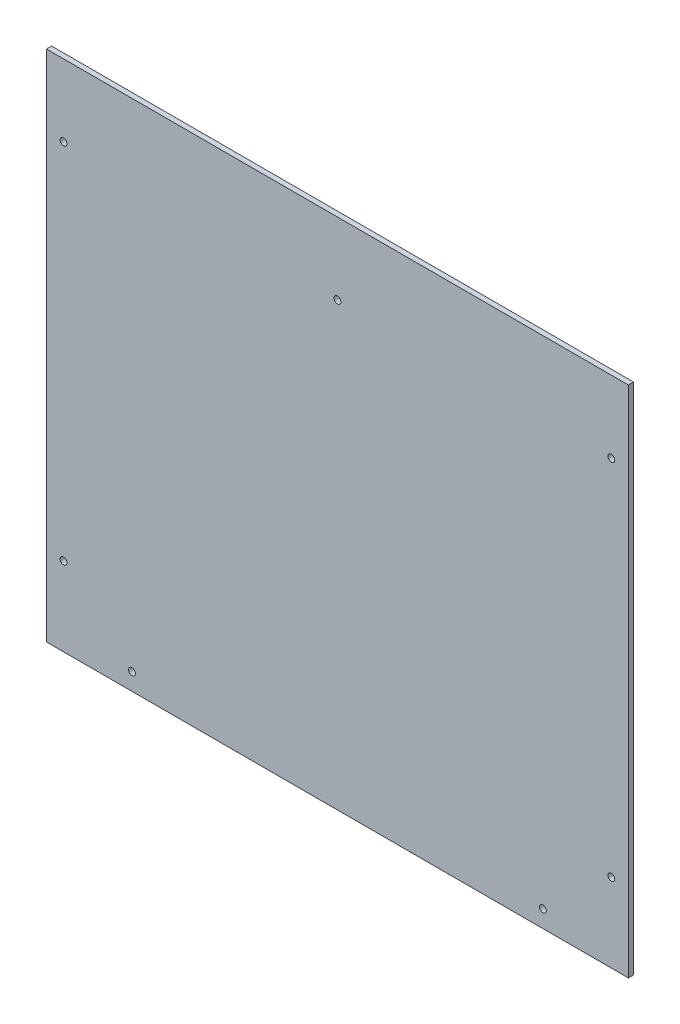
ISO-10303-21;
HEADER;
FILE_DESCRIPTION(('STEP AP214'),'2;1');
FILE_NAME('part.step','',(''),(''),'','','');
FILE_SCHEMA(('AUTOMOTIVE_DESIGN { 1 0 10303 214 1 1 1 1 }'));
ENDSEC;
DATA;
#1=APPLICATION_CONTEXT('core data for automotive mechanical design processes');
#2=APPLICATION_PROTOCOL_DEFINITION('international standard','automotive_design',2000,#1);
#3=PRODUCT_CONTEXT('',#1,'mechanical');
#4=PRODUCT('Part','Part','',(#3));
#5=PRODUCT_RELATED_PRODUCT_CATEGORY('part','',(#4));
#6=PRODUCT_DEFINITION_FORMATION('','',#4);
#7=PRODUCT_DEFINITION_CONTEXT('part definition',#1,'design');
#8=PRODUCT_DEFINITION('design','',#6,#7);
#9=PRODUCT_DEFINITION_SHAPE('','',#8);
#10=(LENGTH_UNIT() NAMED_UNIT(*) SI_UNIT(.MILLI.,.METRE.));
#11=(NAMED_UNIT(*) PLANE_ANGLE_UNIT() SI_UNIT($,.RADIAN.));
#12=(NAMED_UNIT(*) SI_UNIT($,.STERADIAN.) SOLID_ANGLE_UNIT());
#13=UNCERTAINTY_MEASURE_WITH_UNIT(LENGTH_MEASURE(1.E-05),#10,'distance_accuracy_value','');
#14=(GEOMETRIC_REPRESENTATION_CONTEXT(3) GLOBAL_UNCERTAINTY_ASSIGNED_CONTEXT((#13)) GLOBAL_UNIT_ASSIGNED_CONTEXT((#10,
#11,#12)) REPRESENTATION_CONTEXT('',''));
#15=CARTESIAN_POINT('',(0.,0.,0.));
#16=DIRECTION('',(0.,0.,1.));
#17=DIRECTION('',(1.,0.,0.));
#18=AXIS2_PLACEMENT_3D('',#15,#16,#17);
#19=CARTESIAN_POINT('',(-170.,0.,3.));
#20=DIRECTION('',(1.,0.,0.));
#21=DIRECTION('',(0.,1.,0.));
#22=AXIS2_PLACEMENT_3D('',#19,#20,#21);
#23=PLANE('',#22);
#24=DIRECTION('',(0.,0.,1.));
#25=VECTOR('',#24,1.);
#26=CARTESIAN_POINT('',(-170.,148.,0.));
#27=LINE('',#26,#25);
#28=CARTESIAN_POINT('',(-170.,148.,0.));
#29=VERTEX_POINT('',#28);
#30=CARTESIAN_POINT('',(-170.,148.,3.));
#31=VERTEX_POINT('',#30);
#32=EDGE_CURVE('E187',#29,#31,#27,.T.);
#33=ORIENTED_EDGE('',*,*,#32,.F.);
#34=DIRECTION('',(0.,-1.,0.));
#35=VECTOR('',#34,1.);
#36=CARTESIAN_POINT('',(-170.,0.,0.));
#37=LINE('',#36,#35);
#38=CARTESIAN_POINT('',(-170.,-152.,0.));
#39=VERTEX_POINT('',#38);
#40=EDGE_CURVE('E91',#29,#39,#37,.T.);
#41=ORIENTED_EDGE('',*,*,#40,.T.);
#42=DIRECTION('',(0.,0.,-1.));
#43=VECTOR('',#42,1.);
#44=CARTESIAN_POINT('',(-170.,-152.,3.));
#45=LINE('',#44,#43);
#46=CARTESIAN_POINT('',(-170.,-152.,3.));
#47=VERTEX_POINT('',#46);
#48=EDGE_CURVE('E11',#47,#39,#45,.T.);
#49=ORIENTED_EDGE('',*,*,#48,.F.);
#50=DIRECTION('',(0.,-1.,0.));
#51=VECTOR('',#50,1.);
#52=CARTESIAN_POINT('',(-170.,0.,3.));
#53=LINE('',#52,#51);
#54=EDGE_CURVE('E123',#31,#47,#53,.T.);
#55=ORIENTED_EDGE('',*,*,#54,.F.);
#56=EDGE_LOOP('',(#33,#41,#49,#55));
#57=FACE_BOUND('',#56,.T.);
#58=ADVANCED_FACE('F39',(#57),#23,.F.);
#59=CARTESIAN_POINT('',(170.,0.,3.));
#60=DIRECTION('',(1.,0.,0.));
#61=DIRECTION('',(0.,0.,-1.));
#62=AXIS2_PLACEMENT_3D('',#59,#60,#61);
#63=PLANE('',#62);
#64=DIRECTION('',(0.,-1.,0.));
#65=VECTOR('',#64,1.);
#66=CARTESIAN_POINT('',(170.,0.,0.));
#67=LINE('',#66,#65);
#68=CARTESIAN_POINT('',(170.,148.,0.));
#69=VERTEX_POINT('',#68);
#70=CARTESIAN_POINT('',(170.,-152.,0.));
#71=VERTEX_POINT('',#70);
#72=EDGE_CURVE('E76',#69,#71,#67,.T.);
#73=ORIENTED_EDGE('',*,*,#72,.F.);
#74=DIRECTION('',(0.,0.,-1.));
#75=VECTOR('',#74,1.);
#76=CARTESIAN_POINT('',(170.,148.,0.));
#77=LINE('',#76,#75);
#78=CARTESIAN_POINT('',(170.,148.,3.));
#79=VERTEX_POINT('',#78);
#80=EDGE_CURVE('E54',#79,#69,#77,.T.);
#81=ORIENTED_EDGE('',*,*,#80,.F.);
#82=DIRECTION('',(0.,-1.,0.));
#83=VECTOR('',#82,1.);
#84=CARTESIAN_POINT('',(170.,0.,3.));
#85=LINE('',#84,#83);
#86=CARTESIAN_POINT('',(170.,-152.,3.));
#87=VERTEX_POINT('',#86);
#88=EDGE_CURVE('E62',#79,#87,#85,.T.);
#89=ORIENTED_EDGE('',*,*,#88,.T.);
#90=DIRECTION('',(0.,0.,-1.));
#91=VECTOR('',#90,1.);
#92=CARTESIAN_POINT('',(170.,-152.,3.));
#93=LINE('',#92,#91);
#94=EDGE_CURVE('E47',#87,#71,#93,.T.);
#95=ORIENTED_EDGE('',*,*,#94,.T.);
#96=EDGE_LOOP('',(#73,#81,#89,#95));
#97=FACE_BOUND('',#96,.T.);
#98=ADVANCED_FACE('F84',(#97),#63,.T.);
#99=CARTESIAN_POINT('',(0.,0.,3.));
#100=DIRECTION('',(0.,0.,1.));
#101=DIRECTION('',(1.,0.,0.));
#102=AXIS2_PLACEMENT_3D('',#99,#100,#101);
#103=PLANE('',#102);
#104=CARTESIAN_POINT('',(160.,-106.,3.));
#105=DIRECTION('',(0.,0.,1.));
#106=DIRECTION('',(1.,0.,0.));
#107=AXIS2_PLACEMENT_3D('',#104,#105,#106);
#108=CIRCLE('',#107,2.);
#109=CARTESIAN_POINT('',(162.,-106.,3.));
#110=VERTEX_POINT('',#109);
#111=EDGE_CURVE('E98',#110,#110,#108,.T.);
#112=ORIENTED_EDGE('',*,*,#111,.F.);
#113=EDGE_LOOP('',(#112));
#114=FACE_BOUND('',#113,.T.);
#115=CARTESIAN_POINT('',(160.,106.,3.));
#116=DIRECTION('',(0.,0.,1.));
#117=DIRECTION('',(1.,0.,0.));
#118=AXIS2_PLACEMENT_3D('',#115,#116,#117);
#119=CIRCLE('',#118,2.);
#120=CARTESIAN_POINT('',(162.,106.,3.));
#121=VERTEX_POINT('',#120);
#122=EDGE_CURVE('E102',#121,#121,#119,.T.);
#123=ORIENTED_EDGE('',*,*,#122,.F.);
#124=EDGE_LOOP('',(#123));
#125=FACE_BOUND('',#124,.T.);
#126=CARTESIAN_POINT('',(-160.,-106.,3.));
#127=DIRECTION('',(0.,0.,1.));
#128=DIRECTION('',(1.,0.,0.));
#129=AXIS2_PLACEMENT_3D('',#126,#127,#128);
#130=CIRCLE('',#129,2.);
#131=CARTESIAN_POINT('',(-158.,-106.,3.));
#132=VERTEX_POINT('',#131);
#133=EDGE_CURVE('E107',#132,#132,#130,.T.);
#134=ORIENTED_EDGE('',*,*,#133,.F.);
#135=EDGE_LOOP('',(#134));
#136=FACE_BOUND('',#135,.T.);
#137=CARTESIAN_POINT('',(-160.,106.,3.));
#138=DIRECTION('',(0.,0.,1.));
#139=DIRECTION('',(1.,0.,0.));
#140=AXIS2_PLACEMENT_3D('',#137,#138,#139);
#141=CIRCLE('',#140,2.);
#142=CARTESIAN_POINT('',(-158.,106.,3.));
#143=VERTEX_POINT('',#142);
#144=EDGE_CURVE('E114',#143,#143,#141,.T.);
#145=ORIENTED_EDGE('',*,*,#144,.F.);
#146=EDGE_LOOP('',(#145));
#147=FACE_BOUND('',#146,.T.);
#148=CARTESIAN_POINT('',(120.,-142.,3.));
#149=DIRECTION('',(0.,0.,1.));
#150=DIRECTION('',(1.,0.,0.));
#151=AXIS2_PLACEMENT_3D('',#148,#149,#150);
#152=CIRCLE('',#151,2.);
#153=CARTESIAN_POINT('',(122.,-142.,3.));
#154=VERTEX_POINT('',#153);
#155=EDGE_CURVE('E117',#154,#154,#152,.T.);
#156=ORIENTED_EDGE('',*,*,#155,.F.);
#157=EDGE_LOOP('',(#156));
#158=FACE_BOUND('',#157,.T.);
#159=CARTESIAN_POINT('',(-120.,-142.,3.));
#160=DIRECTION('',(0.,0.,1.));
#161=DIRECTION('',(1.,0.,0.));
#162=AXIS2_PLACEMENT_3D('',#159,#160,#161);
#163=CIRCLE('',#162,2.);
#164=CARTESIAN_POINT('',(-118.,-142.,3.));
#165=VERTEX_POINT('',#164);
#166=EDGE_CURVE('E120',#165,#165,#163,.T.);
#167=ORIENTED_EDGE('',*,*,#166,.F.);
#168=EDGE_LOOP('',(#167));
#169=FACE_BOUND('',#168,.T.);
#170=CARTESIAN_POINT('',(0.,106.,3.));
#171=DIRECTION('',(0.,0.,1.));
#172=DIRECTION('',(1.,0.,0.));
#173=AXIS2_PLACEMENT_3D('',#170,#171,#172);
#174=CIRCLE('',#173,2.);
#175=CARTESIAN_POINT('',(2.,106.,3.));
#176=VERTEX_POINT('',#175);
#177=EDGE_CURVE('E88',#176,#176,#174,.T.);
#178=ORIENTED_EDGE('',*,*,#177,.F.);
#179=EDGE_LOOP('',(#178));
#180=FACE_BOUND('',#179,.T.);
#181=ORIENTED_EDGE('',*,*,#88,.F.);
#182=DIRECTION('',(1.,0.,0.));
#183=VECTOR('',#182,1.);
#184=CARTESIAN_POINT('',(-170.,148.,3.));
#185=LINE('',#184,#183);
#186=EDGE_CURVE('E190',#31,#79,#185,.T.);
#187=ORIENTED_EDGE('',*,*,#186,.F.);
#188=ORIENTED_EDGE('',*,*,#54,.T.);
#189=DIRECTION('',(-1.,0.,0.));
#190=VECTOR('',#189,1.);
#191=CARTESIAN_POINT('',(0.,-152.,3.));
#192=LINE('',#191,#190);
#193=EDGE_CURVE('E125',#87,#47,#192,.T.);
#194=ORIENTED_EDGE('',*,*,#193,.F.);
#195=EDGE_LOOP('',(#181,#187,#188,#194));
#196=FACE_BOUND('',#195,.T.);
#197=ADVANCED_FACE('F168',(#114,#125,#136,#147,#158,#169,#180,#196),#103,.T.);
#198=CARTESIAN_POINT('',(0.,0.,0.));
#199=DIRECTION('',(0.,0.,1.));
#200=DIRECTION('',(1.,0.,0.));
#201=AXIS2_PLACEMENT_3D('',#198,#199,#200);
#202=PLANE('',#201);
#203=CARTESIAN_POINT('',(0.,106.,0.));
#204=DIRECTION('',(0.,0.,1.));
#205=DIRECTION('',(1.,0.,0.));
#206=AXIS2_PLACEMENT_3D('',#203,#204,#205);
#207=CIRCLE('',#206,2.);
#208=CARTESIAN_POINT('',(2.,106.,0.));
#209=VERTEX_POINT('',#208);
#210=EDGE_CURVE('E82',#209,#209,#207,.T.);
#211=ORIENTED_EDGE('',*,*,#210,.T.);
#212=EDGE_LOOP('',(#211));
#213=FACE_BOUND('',#212,.T.);
#214=CARTESIAN_POINT('',(-120.,-142.,0.));
#215=DIRECTION('',(0.,0.,1.));
#216=DIRECTION('',(1.,0.,0.));
#217=AXIS2_PLACEMENT_3D('',#214,#215,#216);
#218=CIRCLE('',#217,2.);
#219=CARTESIAN_POINT('',(-118.,-142.,0.));
#220=VERTEX_POINT('',#219);
#221=EDGE_CURVE('E93',#220,#220,#218,.T.);
#222=ORIENTED_EDGE('',*,*,#221,.T.);
#223=EDGE_LOOP('',(#222));
#224=FACE_BOUND('',#223,.T.);
#225=CARTESIAN_POINT('',(120.,-142.,0.));
#226=DIRECTION('',(0.,0.,1.));
#227=DIRECTION('',(1.,0.,0.));
#228=AXIS2_PLACEMENT_3D('',#225,#226,#227);
#229=CIRCLE('',#228,2.);
#230=CARTESIAN_POINT('',(122.,-142.,0.));
#231=VERTEX_POINT('',#230);
#232=EDGE_CURVE('E142',#231,#231,#229,.T.);
#233=ORIENTED_EDGE('',*,*,#232,.T.);
#234=EDGE_LOOP('',(#233));
#235=FACE_BOUND('',#234,.T.);
#236=CARTESIAN_POINT('',(-160.,106.,0.));
#237=DIRECTION('',(0.,0.,1.));
#238=DIRECTION('',(1.,0.,0.));
#239=AXIS2_PLACEMENT_3D('',#236,#237,#238);
#240=CIRCLE('',#239,2.);
#241=CARTESIAN_POINT('',(-158.,106.,0.));
#242=VERTEX_POINT('',#241);
#243=EDGE_CURVE('E139',#242,#242,#240,.T.);
#244=ORIENTED_EDGE('',*,*,#243,.T.);
#245=EDGE_LOOP('',(#244));
#246=FACE_BOUND('',#245,.T.);
#247=CARTESIAN_POINT('',(-160.,-106.,0.));
#248=DIRECTION('',(0.,0.,1.));
#249=DIRECTION('',(1.,0.,0.));
#250=AXIS2_PLACEMENT_3D('',#247,#248,#249);
#251=CIRCLE('',#250,2.);
#252=CARTESIAN_POINT('',(-158.,-106.,0.));
#253=VERTEX_POINT('',#252);
#254=EDGE_CURVE('E136',#253,#253,#251,.T.);
#255=ORIENTED_EDGE('',*,*,#254,.T.);
#256=EDGE_LOOP('',(#255));
#257=FACE_BOUND('',#256,.T.);
#258=CARTESIAN_POINT('',(160.,106.,0.));
#259=DIRECTION('',(0.,0.,1.));
#260=DIRECTION('',(1.,0.,0.));
#261=AXIS2_PLACEMENT_3D('',#258,#259,#260);
#262=CIRCLE('',#261,2.);
#263=CARTESIAN_POINT('',(162.,106.,0.));
#264=VERTEX_POINT('',#263);
#265=EDGE_CURVE('E133',#264,#264,#262,.T.);
#266=ORIENTED_EDGE('',*,*,#265,.T.);
#267=EDGE_LOOP('',(#266));
#268=FACE_BOUND('',#267,.T.);
#269=CARTESIAN_POINT('',(160.,-106.,0.));
#270=DIRECTION('',(0.,0.,1.));
#271=DIRECTION('',(1.,0.,0.));
#272=AXIS2_PLACEMENT_3D('',#269,#270,#271);
#273=CIRCLE('',#272,2.);
#274=CARTESIAN_POINT('',(162.,-106.,0.));
#275=VERTEX_POINT('',#274);
#276=EDGE_CURVE('E130',#275,#275,#273,.T.);
#277=ORIENTED_EDGE('',*,*,#276,.T.);
#278=EDGE_LOOP('',(#277));
#279=FACE_BOUND('',#278,.T.);
#280=DIRECTION('',(-1.,0.,0.));
#281=VECTOR('',#280,1.);
#282=CARTESIAN_POINT('',(-170.,148.,0.));
#283=LINE('',#282,#281);
#284=EDGE_CURVE('E81',#69,#29,#283,.T.);
#285=ORIENTED_EDGE('',*,*,#284,.F.);
#286=ORIENTED_EDGE('',*,*,#72,.T.);
#287=DIRECTION('',(-1.,0.,0.));
#288=VECTOR('',#287,1.);
#289=CARTESIAN_POINT('',(0.,-152.,0.));
#290=LINE('',#289,#288);
#291=EDGE_CURVE('E80',#71,#39,#290,.T.);
#292=ORIENTED_EDGE('',*,*,#291,.T.);
#293=ORIENTED_EDGE('',*,*,#40,.F.);
#294=EDGE_LOOP('',(#285,#286,#292,#293));
#295=FACE_BOUND('',#294,.T.);
#296=ADVANCED_FACE('F77',(#213,#224,#235,#246,#257,#268,#279,#295),#202,.F.);
#297=CARTESIAN_POINT('',(0.,-152.,3.));
#298=DIRECTION('',(0.,-1.,0.));
#299=DIRECTION('',(1.,0.,0.));
#300=AXIS2_PLACEMENT_3D('',#297,#298,#299);
#301=PLANE('',#300);
#302=ORIENTED_EDGE('',*,*,#291,.F.);
#303=ORIENTED_EDGE('',*,*,#94,.F.);
#304=ORIENTED_EDGE('',*,*,#193,.T.);
#305=ORIENTED_EDGE('',*,*,#48,.T.);
#306=EDGE_LOOP('',(#302,#303,#304,#305));
#307=FACE_BOUND('',#306,.T.);
#308=ADVANCED_FACE('F89',(#307),#301,.T.);
#309=CARTESIAN_POINT('',(-120.,-142.,3.));
#310=DIRECTION('',(0.,0.,-1.));
#311=DIRECTION('',(-1.,0.,0.));
#312=AXIS2_PLACEMENT_3D('',#309,#310,#311);
#313=CYLINDRICAL_SURFACE('',#312,2.);
#314=ORIENTED_EDGE('',*,*,#166,.T.);
#315=EDGE_LOOP('',(#314));
#316=FACE_BOUND('',#315,.T.);
#317=ORIENTED_EDGE('',*,*,#221,.F.);
#318=EDGE_LOOP('',(#317));
#319=FACE_BOUND('',#318,.T.);
#320=ADVANCED_FACE('F149',(#316,#319),#313,.F.);
#321=CARTESIAN_POINT('',(120.,-142.,3.));
#322=DIRECTION('',(0.,0.,-1.));
#323=DIRECTION('',(-1.,0.,0.));
#324=AXIS2_PLACEMENT_3D('',#321,#322,#323);
#325=CYLINDRICAL_SURFACE('',#324,2.);
#326=ORIENTED_EDGE('',*,*,#155,.T.);
#327=EDGE_LOOP('',(#326));
#328=FACE_BOUND('',#327,.T.);
#329=ORIENTED_EDGE('',*,*,#232,.F.);
#330=EDGE_LOOP('',(#329));
#331=FACE_BOUND('',#330,.T.);
#332=ADVANCED_FACE('F151',(#328,#331),#325,.F.);
#333=CARTESIAN_POINT('',(-160.,106.,3.));
#334=DIRECTION('',(0.,0.,-1.));
#335=DIRECTION('',(-1.,0.,0.));
#336=AXIS2_PLACEMENT_3D('',#333,#334,#335);
#337=CYLINDRICAL_SURFACE('',#336,2.);
#338=ORIENTED_EDGE('',*,*,#144,.T.);
#339=EDGE_LOOP('',(#338));
#340=FACE_BOUND('',#339,.T.);
#341=ORIENTED_EDGE('',*,*,#243,.F.);
#342=EDGE_LOOP('',(#341));
#343=FACE_BOUND('',#342,.T.);
#344=ADVANCED_FACE('F158',(#340,#343),#337,.F.);
#345=CARTESIAN_POINT('',(-160.,-106.,3.));
#346=DIRECTION('',(0.,0.,-1.));
#347=DIRECTION('',(-1.,0.,0.));
#348=AXIS2_PLACEMENT_3D('',#345,#346,#347);
#349=CYLINDRICAL_SURFACE('',#348,2.);
#350=ORIENTED_EDGE('',*,*,#133,.T.);
#351=EDGE_LOOP('',(#350));
#352=FACE_BOUND('',#351,.T.);
#353=ORIENTED_EDGE('',*,*,#254,.F.);
#354=EDGE_LOOP('',(#353));
#355=FACE_BOUND('',#354,.T.);
#356=ADVANCED_FACE('F217',(#352,#355),#349,.F.);
#357=CARTESIAN_POINT('',(160.,106.,3.));
#358=DIRECTION('',(0.,0.,-1.));
#359=DIRECTION('',(-1.,0.,0.));
#360=AXIS2_PLACEMENT_3D('',#357,#358,#359);
#361=CYLINDRICAL_SURFACE('',#360,2.);
#362=ORIENTED_EDGE('',*,*,#122,.T.);
#363=EDGE_LOOP('',(#362));
#364=FACE_BOUND('',#363,.T.);
#365=ORIENTED_EDGE('',*,*,#265,.F.);
#366=EDGE_LOOP('',(#365));
#367=FACE_BOUND('',#366,.T.);
#368=ADVANCED_FACE('F209',(#364,#367),#361,.F.);
#369=CARTESIAN_POINT('',(160.,-106.,3.));
#370=DIRECTION('',(0.,0.,-1.));
#371=DIRECTION('',(-1.,0.,0.));
#372=AXIS2_PLACEMENT_3D('',#369,#370,#371);
#373=CYLINDRICAL_SURFACE('',#372,2.);
#374=ORIENTED_EDGE('',*,*,#111,.T.);
#375=EDGE_LOOP('',(#374));
#376=FACE_BOUND('',#375,.T.);
#377=ORIENTED_EDGE('',*,*,#276,.F.);
#378=EDGE_LOOP('',(#377));
#379=FACE_BOUND('',#378,.T.);
#380=ADVANCED_FACE('F41',(#376,#379),#373,.F.);
#381=CARTESIAN_POINT('',(0.,106.,3.));
#382=DIRECTION('',(0.,0.,-1.));
#383=DIRECTION('',(-1.,0.,0.));
#384=AXIS2_PLACEMENT_3D('',#381,#382,#383);
#385=CYLINDRICAL_SURFACE('',#384,2.);
#386=ORIENTED_EDGE('',*,*,#177,.T.);
#387=EDGE_LOOP('',(#386));
#388=FACE_BOUND('',#387,.T.);
#389=ORIENTED_EDGE('',*,*,#210,.F.);
#390=EDGE_LOOP('',(#389));
#391=FACE_BOUND('',#390,.T.);
#392=ADVANCED_FACE('F172',(#388,#391),#385,.F.);
#393=CARTESIAN_POINT('',(0.,148.,0.));
#394=DIRECTION('',(0.,1.,0.));
#395=DIRECTION('',(-1.,0.,0.));
#396=AXIS2_PLACEMENT_3D('',#393,#394,#395);
#397=PLANE('',#396);
#398=ORIENTED_EDGE('',*,*,#32,.T.);
#399=ORIENTED_EDGE('',*,*,#186,.T.);
#400=ORIENTED_EDGE('',*,*,#80,.T.);
#401=ORIENTED_EDGE('',*,*,#284,.T.);
#402=EDGE_LOOP('',(#398,#399,#400,#401));
#403=FACE_BOUND('',#402,.T.);
#404=ADVANCED_FACE('F175',(#403),#397,.T.);
#405=CLOSED_SHELL('',(#58,#98,#197,#296,#308,#320,#332,#344,#356,#368,#380,#392,#404));
#406=MANIFOLD_SOLID_BREP('B2',#405);
#407=ADVANCED_BREP_SHAPE_REPRESENTATION('',(#18,#406),#14);
#408=SHAPE_DEFINITION_REPRESENTATION(#9,#407);
ENDSEC;
END-ISO-10303-21;
